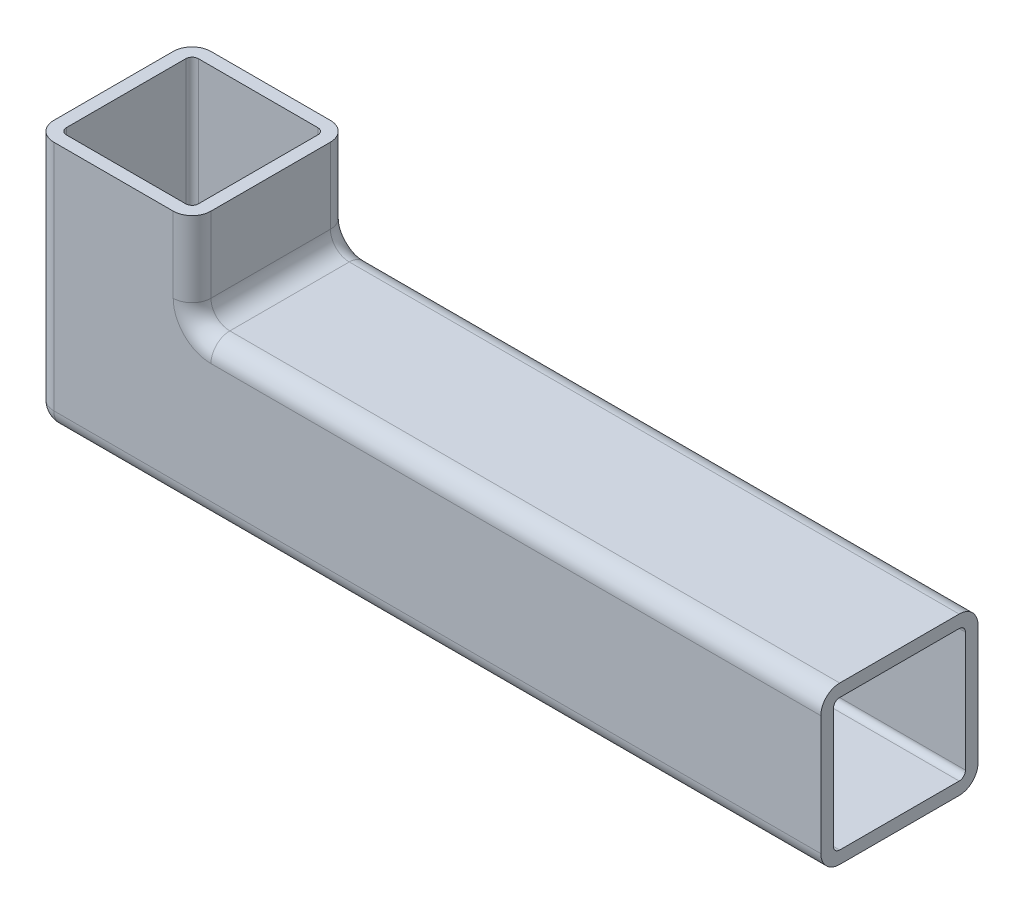
ISO-10303-21;
HEADER;
FILE_DESCRIPTION(('STEP AP214'),'2;1');
FILE_NAME('part.step','',(''),(''),'','','');
FILE_SCHEMA(('AUTOMOTIVE_DESIGN { 1 0 10303 214 1 1 1 1 }'));
ENDSEC;
DATA;
#1=APPLICATION_CONTEXT('core data for automotive mechanical design processes');
#2=APPLICATION_PROTOCOL_DEFINITION('international standard','automotive_design',2000,#1);
#3=PRODUCT_CONTEXT('',#1,'mechanical');
#4=PRODUCT('Part','Part','',(#3));
#5=PRODUCT_RELATED_PRODUCT_CATEGORY('part','',(#4));
#6=PRODUCT_DEFINITION_FORMATION('','',#4);
#7=PRODUCT_DEFINITION_CONTEXT('part definition',#1,'design');
#8=PRODUCT_DEFINITION('design','',#6,#7);
#9=PRODUCT_DEFINITION_SHAPE('','',#8);
#10=(LENGTH_UNIT() NAMED_UNIT(*) SI_UNIT(.MILLI.,.METRE.));
#11=(NAMED_UNIT(*) PLANE_ANGLE_UNIT() SI_UNIT($,.RADIAN.));
#12=(NAMED_UNIT(*) SI_UNIT($,.STERADIAN.) SOLID_ANGLE_UNIT());
#13=UNCERTAINTY_MEASURE_WITH_UNIT(LENGTH_MEASURE(1.E-05),#10,'distance_accuracy_value','');
#14=(GEOMETRIC_REPRESENTATION_CONTEXT(3) GLOBAL_UNCERTAINTY_ASSIGNED_CONTEXT((#13)) GLOBAL_UNIT_ASSIGNED_CONTEXT((#10,
#11,#12)) REPRESENTATION_CONTEXT('',''));
#15=CARTESIAN_POINT('',(0.,0.,0.));
#16=DIRECTION('',(0.,0.,1.));
#17=DIRECTION('',(1.,0.,0.));
#18=AXIS2_PLACEMENT_3D('',#15,#16,#17);
#19=CARTESIAN_POINT('',(0.,0.,25.));
#20=DIRECTION('',(1.,0.,0.));
#21=DIRECTION('',(0.,0.,-1.));
#22=AXIS2_PLACEMENT_3D('',#19,#20,#21);
#23=PLANE('',#22);
#24=DIRECTION('',(0.,-1.,0.));
#25=VECTOR('',#24,1.);
#26=CARTESIAN_POINT('',(0.,0.,3.));
#27=LINE('',#26,#25);
#28=CARTESIAN_POINT('',(0.,40.,3.));
#29=VERTEX_POINT('',#28);
#30=CARTESIAN_POINT('',(0.,3.,3.));
#31=VERTEX_POINT('',#30);
#32=EDGE_CURVE('E355',#29,#31,#27,.T.);
#33=ORIENTED_EDGE('',*,*,#32,.T.);
#34=DIRECTION('',(0.,0.,-1.));
#35=VECTOR('',#34,1.);
#36=CARTESIAN_POINT('',(0.,3.,25.));
#37=LINE('',#36,#35);
#38=CARTESIAN_POINT('',(0.,3.,22.));
#39=VERTEX_POINT('',#38);
#40=EDGE_CURVE('E405',#31,#39,#37,.F.);
#41=ORIENTED_EDGE('',*,*,#40,.T.);
#42=DIRECTION('',(0.,-1.,0.));
#43=VECTOR('',#42,1.);
#44=CARTESIAN_POINT('',(0.,0.,22.));
#45=LINE('',#44,#43);
#46=CARTESIAN_POINT('',(0.,40.,22.));
#47=VERTEX_POINT('',#46);
#48=EDGE_CURVE('E353',#39,#47,#45,.F.);
#49=ORIENTED_EDGE('',*,*,#48,.T.);
#50=DIRECTION('',(0.,0.,-1.));
#51=VECTOR('',#50,1.);
#52=CARTESIAN_POINT('',(0.,40.,25.));
#53=LINE('',#52,#51);
#54=EDGE_CURVE('E258',#47,#29,#53,.T.);
#55=ORIENTED_EDGE('',*,*,#54,.T.);
#56=EDGE_LOOP('',(#33,#41,#49,#55));
#57=FACE_BOUND('',#56,.T.);
#58=ADVANCED_FACE('F42',(#57),#23,.F.);
#59=CARTESIAN_POINT('',(0.,0.,25.));
#60=DIRECTION('',(0.,1.,0.));
#61=DIRECTION('',(0.,0.,1.));
#62=AXIS2_PLACEMENT_3D('',#59,#60,#61);
#63=PLANE('',#62);
#64=DIRECTION('',(1.,0.,0.));
#65=VECTOR('',#64,1.);
#66=CARTESIAN_POINT('',(0.,0.,22.));
#67=LINE('',#66,#65);
#68=CARTESIAN_POINT('',(125.,0.,22.));
#69=VERTEX_POINT('',#68);
#70=CARTESIAN_POINT('',(3.,0.,22.));
#71=VERTEX_POINT('',#70);
#72=EDGE_CURVE('E336',#69,#71,#67,.F.);
#73=ORIENTED_EDGE('',*,*,#72,.T.);
#74=DIRECTION('',(0.,0.,-1.));
#75=VECTOR('',#74,1.);
#76=CARTESIAN_POINT('',(3.,0.,25.));
#77=LINE('',#76,#75);
#78=CARTESIAN_POINT('',(3.,0.,3.));
#79=VERTEX_POINT('',#78);
#80=EDGE_CURVE('E66',#71,#79,#77,.T.);
#81=ORIENTED_EDGE('',*,*,#80,.T.);
#82=DIRECTION('',(1.,0.,0.));
#83=VECTOR('',#82,1.);
#84=CARTESIAN_POINT('',(125.,0.,3.));
#85=LINE('',#84,#83);
#86=CARTESIAN_POINT('',(125.,0.,3.));
#87=VERTEX_POINT('',#86);
#88=EDGE_CURVE('E382',#79,#87,#85,.T.);
#89=ORIENTED_EDGE('',*,*,#88,.T.);
#90=DIRECTION('',(0.,0.,-1.));
#91=VECTOR('',#90,1.);
#92=CARTESIAN_POINT('',(125.,0.,25.));
#93=LINE('',#92,#91);
#94=EDGE_CURVE('E253',#69,#87,#93,.T.);
#95=ORIENTED_EDGE('',*,*,#94,.F.);
#96=EDGE_LOOP('',(#73,#81,#89,#95));
#97=FACE_BOUND('',#96,.T.);
#98=ADVANCED_FACE('F531',(#97),#63,.F.);
#99=CARTESIAN_POINT('',(125.,0.,25.));
#100=DIRECTION('',(-1.,0.,0.));
#101=DIRECTION('',(0.,0.,1.));
#102=AXIS2_PLACEMENT_3D('',#99,#100,#101);
#103=PLANE('',#102);
#104=DIRECTION('',(0.,0.,-1.));
#105=VECTOR('',#104,1.);
#106=CARTESIAN_POINT('',(125.,2.,23.));
#107=LINE('',#106,#105);
#108=CARTESIAN_POINT('',(125.,2.,22.));
#109=VERTEX_POINT('',#108);
#110=CARTESIAN_POINT('',(125.,2.,3.));
#111=VERTEX_POINT('',#110);
#112=EDGE_CURVE('E458',#109,#111,#107,.T.);
#113=ORIENTED_EDGE('',*,*,#112,.F.);
#114=CARTESIAN_POINT('',(125.,3.,22.));
#115=DIRECTION('',(-1.,0.,0.));
#116=DIRECTION('',(0.,0.,1.));
#117=AXIS2_PLACEMENT_3D('',#114,#115,#116);
#118=CIRCLE('',#117,1.);
#119=CARTESIAN_POINT('',(125.,3.,23.));
#120=VERTEX_POINT('',#119);
#121=EDGE_CURVE('E278',#109,#120,#118,.T.);
#122=ORIENTED_EDGE('',*,*,#121,.T.);
#123=DIRECTION('',(0.,-1.,0.));
#124=VECTOR('',#123,1.);
#125=CARTESIAN_POINT('',(125.,23.,23.));
#126=LINE('',#125,#124);
#127=CARTESIAN_POINT('',(125.,22.,23.));
#128=VERTEX_POINT('',#127);
#129=EDGE_CURVE('E460',#128,#120,#126,.T.);
#130=ORIENTED_EDGE('',*,*,#129,.F.);
#131=CARTESIAN_POINT('',(125.,22.,22.));
#132=DIRECTION('',(-1.,0.,0.));
#133=DIRECTION('',(0.,0.,1.));
#134=AXIS2_PLACEMENT_3D('',#131,#132,#133);
#135=CIRCLE('',#134,1.);
#136=CARTESIAN_POINT('',(125.,23.,22.));
#137=VERTEX_POINT('',#136);
#138=EDGE_CURVE('E299',#128,#137,#135,.T.);
#139=ORIENTED_EDGE('',*,*,#138,.T.);
#140=DIRECTION('',(0.,0.,1.));
#141=VECTOR('',#140,1.);
#142=CARTESIAN_POINT('',(125.,23.,23.));
#143=LINE('',#142,#141);
#144=CARTESIAN_POINT('',(125.,23.,3.));
#145=VERTEX_POINT('',#144);
#146=EDGE_CURVE('E452',#145,#137,#143,.T.);
#147=ORIENTED_EDGE('',*,*,#146,.F.);
#148=CARTESIAN_POINT('',(125.,22.,3.));
#149=DIRECTION('',(-1.,0.,0.));
#150=DIRECTION('',(0.,0.,1.));
#151=AXIS2_PLACEMENT_3D('',#148,#149,#150);
#152=CIRCLE('',#151,1.);
#153=CARTESIAN_POINT('',(125.,22.,2.));
#154=VERTEX_POINT('',#153);
#155=EDGE_CURVE('E291',#145,#154,#152,.T.);
#156=ORIENTED_EDGE('',*,*,#155,.T.);
#157=DIRECTION('',(0.,1.,0.));
#158=VECTOR('',#157,1.);
#159=CARTESIAN_POINT('',(125.,23.,2.));
#160=LINE('',#159,#158);
#161=CARTESIAN_POINT('',(125.,3.,2.));
#162=VERTEX_POINT('',#161);
#163=EDGE_CURVE('E455',#162,#154,#160,.T.);
#164=ORIENTED_EDGE('',*,*,#163,.F.);
#165=CARTESIAN_POINT('',(125.,3.,3.));
#166=DIRECTION('',(-1.,0.,0.));
#167=DIRECTION('',(0.,0.,1.));
#168=AXIS2_PLACEMENT_3D('',#165,#166,#167);
#169=CIRCLE('',#168,1.);
#170=EDGE_CURVE('E246',#162,#111,#169,.T.);
#171=ORIENTED_EDGE('',*,*,#170,.T.);
#172=EDGE_LOOP('',(#113,#122,#130,#139,#147,#156,#164,#171));
#173=FACE_BOUND('',#172,.T.);
#174=ORIENTED_EDGE('',*,*,#94,.T.);
#175=CARTESIAN_POINT('',(125.,3.,3.));
#176=DIRECTION('',(-1.,0.,0.));
#177=DIRECTION('',(0.,0.,1.));
#178=AXIS2_PLACEMENT_3D('',#175,#176,#177);
#179=CIRCLE('',#178,3.);
#180=CARTESIAN_POINT('',(125.,3.,0.));
#181=VERTEX_POINT('',#180);
#182=EDGE_CURVE('E386',#87,#181,#179,.F.);
#183=ORIENTED_EDGE('',*,*,#182,.T.);
#184=DIRECTION('',(0.,1.,0.));
#185=VECTOR('',#184,1.);
#186=CARTESIAN_POINT('',(125.,0.,0.));
#187=LINE('',#186,#185);
#188=CARTESIAN_POINT('',(125.,22.,0.));
#189=VERTEX_POINT('',#188);
#190=EDGE_CURVE('E429',#181,#189,#187,.T.);
#191=ORIENTED_EDGE('',*,*,#190,.T.);
#192=CARTESIAN_POINT('',(125.,22.,3.));
#193=DIRECTION('',(-1.,0.,0.));
#194=DIRECTION('',(0.,0.,1.));
#195=AXIS2_PLACEMENT_3D('',#192,#193,#194);
#196=CIRCLE('',#195,3.);
#197=CARTESIAN_POINT('',(125.,25.,3.));
#198=VERTEX_POINT('',#197);
#199=EDGE_CURVE('E384',#189,#198,#196,.F.);
#200=ORIENTED_EDGE('',*,*,#199,.T.);
#201=DIRECTION('',(0.,0.,1.));
#202=VECTOR('',#201,1.);
#203=CARTESIAN_POINT('',(125.,25.,0.));
#204=LINE('',#203,#202);
#205=CARTESIAN_POINT('',(125.,25.,22.));
#206=VERTEX_POINT('',#205);
#207=EDGE_CURVE('E448',#198,#206,#204,.T.);
#208=ORIENTED_EDGE('',*,*,#207,.T.);
#209=CARTESIAN_POINT('',(125.,22.,22.));
#210=DIRECTION('',(-1.,0.,0.));
#211=DIRECTION('',(0.,0.,1.));
#212=AXIS2_PLACEMENT_3D('',#209,#210,#211);
#213=CIRCLE('',#212,3.);
#214=CARTESIAN_POINT('',(125.,22.,25.));
#215=VERTEX_POINT('',#214);
#216=EDGE_CURVE('E332',#206,#215,#213,.F.);
#217=ORIENTED_EDGE('',*,*,#216,.T.);
#218=DIRECTION('',(0.,1.,0.));
#219=VECTOR('',#218,1.);
#220=CARTESIAN_POINT('',(125.,0.,25.));
#221=LINE('',#220,#219);
#222=CARTESIAN_POINT('',(125.,3.,25.));
#223=VERTEX_POINT('',#222);
#224=EDGE_CURVE('E440',#223,#215,#221,.T.);
#225=ORIENTED_EDGE('',*,*,#224,.F.);
#226=CARTESIAN_POINT('',(125.,3.,22.));
#227=DIRECTION('',(-1.,0.,0.));
#228=DIRECTION('',(0.,0.,1.));
#229=AXIS2_PLACEMENT_3D('',#226,#227,#228);
#230=CIRCLE('',#229,3.);
#231=EDGE_CURVE('E334',#223,#69,#230,.F.);
#232=ORIENTED_EDGE('',*,*,#231,.T.);
#233=EDGE_LOOP('',(#174,#183,#191,#200,#208,#217,#225,#232));
#234=FACE_BOUND('',#233,.T.);
#235=ADVANCED_FACE('F490',(#173,#234),#103,.F.);
#236=CARTESIAN_POINT('',(0.,40.,25.));
#237=DIRECTION('',(0.,-1.,0.));
#238=DIRECTION('',(0.,0.,-1.));
#239=AXIS2_PLACEMENT_3D('',#236,#237,#238);
#240=PLANE('',#239);
#241=DIRECTION('',(-1.,0.,0.));
#242=VECTOR('',#241,1.);
#243=CARTESIAN_POINT('',(23.,40.,2.));
#244=LINE('',#243,#242);
#245=CARTESIAN_POINT('',(22.,40.,2.));
#246=VERTEX_POINT('',#245);
#247=CARTESIAN_POINT('',(3.,40.,2.));
#248=VERTEX_POINT('',#247);
#249=EDGE_CURVE('E224',#246,#248,#244,.T.);
#250=ORIENTED_EDGE('',*,*,#249,.F.);
#251=CARTESIAN_POINT('',(22.,40.,3.00000000000001));
#252=DIRECTION('',(0.,-1.,0.));
#253=DIRECTION('',(0.,0.,-1.));
#254=AXIS2_PLACEMENT_3D('',#251,#252,#253);
#255=CIRCLE('',#254,1.);
#256=CARTESIAN_POINT('',(23.,40.,3.00000000000001));
#257=VERTEX_POINT('',#256);
#258=EDGE_CURVE('E314',#246,#257,#255,.T.);
#259=ORIENTED_EDGE('',*,*,#258,.T.);
#260=DIRECTION('',(0.,0.,-1.));
#261=VECTOR('',#260,1.);
#262=CARTESIAN_POINT('',(23.,40.,2.));
#263=LINE('',#262,#261);
#264=CARTESIAN_POINT('',(23.,40.,22.));
#265=VERTEX_POINT('',#264);
#266=EDGE_CURVE('E235',#265,#257,#263,.T.);
#267=ORIENTED_EDGE('',*,*,#266,.F.);
#268=CARTESIAN_POINT('',(22.,40.,22.));
#269=DIRECTION('',(0.,-1.,0.));
#270=DIRECTION('',(0.,0.,-1.));
#271=AXIS2_PLACEMENT_3D('',#268,#269,#270);
#272=CIRCLE('',#271,1.);
#273=CARTESIAN_POINT('',(22.,40.,23.));
#274=VERTEX_POINT('',#273);
#275=EDGE_CURVE('E307',#265,#274,#272,.T.);
#276=ORIENTED_EDGE('',*,*,#275,.T.);
#277=DIRECTION('',(1.,0.,0.));
#278=VECTOR('',#277,1.);
#279=CARTESIAN_POINT('',(23.,40.,23.));
#280=LINE('',#279,#278);
#281=CARTESIAN_POINT('',(3.,40.,23.));
#282=VERTEX_POINT('',#281);
#283=EDGE_CURVE('E466',#282,#274,#280,.T.);
#284=ORIENTED_EDGE('',*,*,#283,.F.);
#285=CARTESIAN_POINT('',(3.,40.,22.));
#286=DIRECTION('',(0.,-1.,0.));
#287=DIRECTION('',(0.,0.,-1.));
#288=AXIS2_PLACEMENT_3D('',#285,#286,#287);
#289=CIRCLE('',#288,1.);
#290=CARTESIAN_POINT('',(2.,40.,22.));
#291=VERTEX_POINT('',#290);
#292=EDGE_CURVE('E281',#282,#291,#289,.T.);
#293=ORIENTED_EDGE('',*,*,#292,.T.);
#294=DIRECTION('',(0.,0.,1.));
#295=VECTOR('',#294,1.);
#296=CARTESIAN_POINT('',(2.,40.,2.));
#297=LINE('',#296,#295);
#298=CARTESIAN_POINT('',(2.,40.,3.00000000000001));
#299=VERTEX_POINT('',#298);
#300=EDGE_CURVE('E234',#299,#291,#297,.T.);
#301=ORIENTED_EDGE('',*,*,#300,.F.);
#302=CARTESIAN_POINT('',(3.,40.,3.00000000000001));
#303=DIRECTION('',(0.,-1.,0.));
#304=DIRECTION('',(0.,0.,-1.));
#305=AXIS2_PLACEMENT_3D('',#302,#303,#304);
#306=CIRCLE('',#305,1.);
#307=EDGE_CURVE('E239',#299,#248,#306,.T.);
#308=ORIENTED_EDGE('',*,*,#307,.T.);
#309=EDGE_LOOP('',(#250,#259,#267,#276,#284,#293,#301,#308));
#310=FACE_BOUND('',#309,.T.);
#311=DIRECTION('',(-1.,0.,0.));
#312=VECTOR('',#311,1.);
#313=CARTESIAN_POINT('',(0.,40.,0.));
#314=LINE('',#313,#312);
#315=CARTESIAN_POINT('',(22.,40.,0.));
#316=VERTEX_POINT('',#315);
#317=CARTESIAN_POINT('',(3.,40.,0.));
#318=VERTEX_POINT('',#317);
#319=EDGE_CURVE('E435',#316,#318,#314,.T.);
#320=ORIENTED_EDGE('',*,*,#319,.T.);
#321=CARTESIAN_POINT('',(3.,40.,3.));
#322=DIRECTION('',(0.,-1.,0.));
#323=DIRECTION('',(0.,0.,-1.));
#324=AXIS2_PLACEMENT_3D('',#321,#322,#323);
#325=CIRCLE('',#324,3.);
#326=EDGE_CURVE('E380',#318,#29,#325,.F.);
#327=ORIENTED_EDGE('',*,*,#326,.T.);
#328=ORIENTED_EDGE('',*,*,#54,.F.);
#329=CARTESIAN_POINT('',(3.,40.,22.));
#330=DIRECTION('',(0.,-1.,0.));
#331=DIRECTION('',(0.,0.,-1.));
#332=AXIS2_PLACEMENT_3D('',#329,#330,#331);
#333=CIRCLE('',#332,3.);
#334=CARTESIAN_POINT('',(3.,40.,25.));
#335=VERTEX_POINT('',#334);
#336=EDGE_CURVE('E348',#47,#335,#333,.F.);
#337=ORIENTED_EDGE('',*,*,#336,.T.);
#338=DIRECTION('',(-1.,0.,0.));
#339=VECTOR('',#338,1.);
#340=CARTESIAN_POINT('',(0.,40.,25.));
#341=LINE('',#340,#339);
#342=CARTESIAN_POINT('',(22.,40.,25.));
#343=VERTEX_POINT('',#342);
#344=EDGE_CURVE('E438',#343,#335,#341,.T.);
#345=ORIENTED_EDGE('',*,*,#344,.F.);
#346=CARTESIAN_POINT('',(22.,40.,22.));
#347=DIRECTION('',(0.,-1.,0.));
#348=DIRECTION('',(0.,0.,-1.));
#349=AXIS2_PLACEMENT_3D('',#346,#347,#348);
#350=CIRCLE('',#349,3.);
#351=CARTESIAN_POINT('',(25.,40.,22.));
#352=VERTEX_POINT('',#351);
#353=EDGE_CURVE('E350',#343,#352,#350,.F.);
#354=ORIENTED_EDGE('',*,*,#353,.T.);
#355=DIRECTION('',(0.,0.,1.));
#356=VECTOR('',#355,1.);
#357=CARTESIAN_POINT('',(25.,40.,0.));
#358=LINE('',#357,#356);
#359=CARTESIAN_POINT('',(25.,40.,3.));
#360=VERTEX_POINT('',#359);
#361=EDGE_CURVE('E444',#360,#352,#358,.T.);
#362=ORIENTED_EDGE('',*,*,#361,.F.);
#363=CARTESIAN_POINT('',(22.,40.,3.));
#364=DIRECTION('',(0.,-1.,0.));
#365=DIRECTION('',(0.,0.,-1.));
#366=AXIS2_PLACEMENT_3D('',#363,#364,#365);
#367=CIRCLE('',#366,3.);
#368=EDGE_CURVE('E378',#360,#316,#367,.F.);
#369=ORIENTED_EDGE('',*,*,#368,.T.);
#370=EDGE_LOOP('',(#320,#327,#328,#337,#345,#354,#362,#369));
#371=FACE_BOUND('',#370,.T.);
#372=ADVANCED_FACE('F240',(#310,#371),#240,.F.);
#373=CARTESIAN_POINT('',(0.,0.,25.));
#374=DIRECTION('',(0.,0.,-1.));
#375=DIRECTION('',(-1.,0.,0.));
#376=AXIS2_PLACEMENT_3D('',#373,#374,#375);
#377=PLANE('',#376);
#378=ORIENTED_EDGE('',*,*,#224,.T.);
#379=DIRECTION('',(1.,0.,0.));
#380=VECTOR('',#379,1.);
#381=CARTESIAN_POINT('',(0.,22.,25.));
#382=LINE('',#381,#380);
#383=CARTESIAN_POINT('',(28.,22.,25.));
#384=VERTEX_POINT('',#383);
#385=EDGE_CURVE('E330',#215,#384,#382,.F.);
#386=ORIENTED_EDGE('',*,*,#385,.T.);
#387=CARTESIAN_POINT('',(28.,28.,25.));
#388=DIRECTION('',(0.,0.,-1.));
#389=DIRECTION('',(-1.,0.,0.));
#390=AXIS2_PLACEMENT_3D('',#387,#388,#389);
#391=CIRCLE('',#390,6.);
#392=CARTESIAN_POINT('',(22.,28.,25.));
#393=VERTEX_POINT('',#392);
#394=EDGE_CURVE('E327',#393,#384,#391,.F.);
#395=ORIENTED_EDGE('',*,*,#394,.F.);
#396=DIRECTION('',(0.,-1.,0.));
#397=VECTOR('',#396,1.);
#398=CARTESIAN_POINT('',(22.,0.,25.));
#399=LINE('',#398,#397);
#400=EDGE_CURVE('E325',#393,#343,#399,.F.);
#401=ORIENTED_EDGE('',*,*,#400,.T.);
#402=ORIENTED_EDGE('',*,*,#344,.T.);
#403=DIRECTION('',(0.,-1.,0.));
#404=VECTOR('',#403,1.);
#405=CARTESIAN_POINT('',(3.,0.,25.));
#406=LINE('',#405,#404);
#407=CARTESIAN_POINT('',(3.,3.,25.));
#408=VERTEX_POINT('',#407);
#409=EDGE_CURVE('E319',#335,#408,#406,.T.);
#410=ORIENTED_EDGE('',*,*,#409,.T.);
#411=DIRECTION('',(1.,0.,0.));
#412=VECTOR('',#411,1.);
#413=CARTESIAN_POINT('',(0.,3.,25.));
#414=LINE('',#413,#412);
#415=EDGE_CURVE('E322',#408,#223,#414,.T.);
#416=ORIENTED_EDGE('',*,*,#415,.T.);
#417=EDGE_LOOP('',(#378,#386,#395,#401,#402,#410,#416));
#418=FACE_BOUND('',#417,.T.);
#419=ADVANCED_FACE('F566',(#418),#377,.F.);
#420=CARTESIAN_POINT('',(0.,0.,0.));
#421=DIRECTION('',(0.,0.,-1.));
#422=DIRECTION('',(-1.,0.,0.));
#423=AXIS2_PLACEMENT_3D('',#420,#421,#422);
#424=PLANE('',#423);
#425=DIRECTION('',(1.,0.,0.));
#426=VECTOR('',#425,1.);
#427=CARTESIAN_POINT('',(0.,3.,0.));
#428=LINE('',#427,#426);
#429=CARTESIAN_POINT('',(3.,3.,0.));
#430=VERTEX_POINT('',#429);
#431=EDGE_CURVE('E373',#181,#430,#428,.F.);
#432=ORIENTED_EDGE('',*,*,#431,.T.);
#433=DIRECTION('',(0.,-1.,0.));
#434=VECTOR('',#433,1.);
#435=CARTESIAN_POINT('',(3.,40.,0.));
#436=LINE('',#435,#434);
#437=EDGE_CURVE('E376',#430,#318,#436,.F.);
#438=ORIENTED_EDGE('',*,*,#437,.T.);
#439=ORIENTED_EDGE('',*,*,#319,.F.);
#440=DIRECTION('',(0.,-1.,0.));
#441=VECTOR('',#440,1.);
#442=CARTESIAN_POINT('',(22.,28.,0.));
#443=LINE('',#442,#441);
#444=CARTESIAN_POINT('',(22.,28.,0.));
#445=VERTEX_POINT('',#444);
#446=EDGE_CURVE('E366',#316,#445,#443,.T.);
#447=ORIENTED_EDGE('',*,*,#446,.T.);
#448=CARTESIAN_POINT('',(28.,28.,0.));
#449=DIRECTION('',(0.,0.,-1.));
#450=DIRECTION('',(-1.,0.,0.));
#451=AXIS2_PLACEMENT_3D('',#448,#449,#450);
#452=CIRCLE('',#451,6.);
#453=CARTESIAN_POINT('',(28.,22.,0.));
#454=VERTEX_POINT('',#453);
#455=EDGE_CURVE('E368',#445,#454,#452,.F.);
#456=ORIENTED_EDGE('',*,*,#455,.T.);
#457=DIRECTION('',(1.,0.,0.));
#458=VECTOR('',#457,1.);
#459=CARTESIAN_POINT('',(125.,22.,0.));
#460=LINE('',#459,#458);
#461=EDGE_CURVE('E370',#454,#189,#460,.T.);
#462=ORIENTED_EDGE('',*,*,#461,.T.);
#463=ORIENTED_EDGE('',*,*,#190,.F.);
#464=EDGE_LOOP('',(#432,#438,#439,#447,#456,#462,#463));
#465=FACE_BOUND('',#464,.T.);
#466=ADVANCED_FACE('F425',(#465),#424,.T.);
#467=CARTESIAN_POINT('',(25.,40.,0.));
#468=DIRECTION('',(-1.,0.,0.));
#469=DIRECTION('',(0.,-1.,0.));
#470=AXIS2_PLACEMENT_3D('',#467,#468,#469);
#471=PLANE('',#470);
#472=DIRECTION('',(0.,0.,1.));
#473=VECTOR('',#472,1.);
#474=CARTESIAN_POINT('',(25.,28.,0.));
#475=LINE('',#474,#473);
#476=CARTESIAN_POINT('',(25.,28.,22.));
#477=VERTEX_POINT('',#476);
#478=CARTESIAN_POINT('',(25.,28.,3.));
#479=VERTEX_POINT('',#478);
#480=EDGE_CURVE('E345',#477,#479,#475,.F.);
#481=ORIENTED_EDGE('',*,*,#480,.T.);
#482=DIRECTION('',(0.,-1.,0.));
#483=VECTOR('',#482,1.);
#484=CARTESIAN_POINT('',(25.,40.,3.));
#485=LINE('',#484,#483);
#486=EDGE_CURVE('E392',#479,#360,#485,.F.);
#487=ORIENTED_EDGE('',*,*,#486,.T.);
#488=ORIENTED_EDGE('',*,*,#361,.T.);
#489=DIRECTION('',(0.,-1.,0.));
#490=VECTOR('',#489,1.);
#491=CARTESIAN_POINT('',(25.,40.,22.));
#492=LINE('',#491,#490);
#493=EDGE_CURVE('E343',#352,#477,#492,.T.);
#494=ORIENTED_EDGE('',*,*,#493,.T.);
#495=EDGE_LOOP('',(#481,#487,#488,#494));
#496=FACE_BOUND('',#495,.T.);
#497=ADVANCED_FACE('F561',(#496),#471,.F.);
#498=CARTESIAN_POINT('',(25.,25.,0.));
#499=DIRECTION('',(0.,-1.,0.));
#500=DIRECTION('',(0.,0.,-1.));
#501=AXIS2_PLACEMENT_3D('',#498,#499,#500);
#502=PLANE('',#501);
#503=ORIENTED_EDGE('',*,*,#207,.F.);
#504=DIRECTION('',(1.,0.,0.));
#505=VECTOR('',#504,1.);
#506=CARTESIAN_POINT('',(28.,25.,3.));
#507=LINE('',#506,#505);
#508=CARTESIAN_POINT('',(28.,25.,3.));
#509=VERTEX_POINT('',#508);
#510=EDGE_CURVE('E388',#198,#509,#507,.F.);
#511=ORIENTED_EDGE('',*,*,#510,.T.);
#512=DIRECTION('',(0.,0.,1.));
#513=VECTOR('',#512,1.);
#514=CARTESIAN_POINT('',(28.,25.,25.));
#515=LINE('',#514,#513);
#516=CARTESIAN_POINT('',(28.,25.,22.));
#517=VERTEX_POINT('',#516);
#518=EDGE_CURVE('E338',#509,#517,#515,.T.);
#519=ORIENTED_EDGE('',*,*,#518,.T.);
#520=DIRECTION('',(1.,0.,0.));
#521=VECTOR('',#520,1.);
#522=CARTESIAN_POINT('',(25.,25.,22.));
#523=LINE('',#522,#521);
#524=EDGE_CURVE('E340',#517,#206,#523,.T.);
#525=ORIENTED_EDGE('',*,*,#524,.T.);
#526=EDGE_LOOP('',(#503,#511,#519,#525));
#527=FACE_BOUND('',#526,.T.);
#528=ADVANCED_FACE('F558',(#527),#502,.F.);
#529=CARTESIAN_POINT('',(2.,23.,23.));
#530=DIRECTION('',(0.,0.,1.));
#531=DIRECTION('',(0.,-1.,0.));
#532=AXIS2_PLACEMENT_3D('',#529,#530,#531);
#533=PLANE('',#532);
#534=ORIENTED_EDGE('',*,*,#283,.T.);
#535=DIRECTION('',(0.,1.,0.));
#536=VECTOR('',#535,1.);
#537=CARTESIAN_POINT('',(22.,22.,23.));
#538=LINE('',#537,#536);
#539=CARTESIAN_POINT('',(22.,22.,23.));
#540=VERTEX_POINT('',#539);
#541=EDGE_CURVE('E304',#274,#540,#538,.F.);
#542=ORIENTED_EDGE('',*,*,#541,.T.);
#543=DIRECTION('',(1.,0.,0.));
#544=VECTOR('',#543,1.);
#545=CARTESIAN_POINT('',(125.,22.,23.));
#546=LINE('',#545,#544);
#547=EDGE_CURVE('E293',#540,#128,#546,.T.);
#548=ORIENTED_EDGE('',*,*,#547,.T.);
#549=ORIENTED_EDGE('',*,*,#129,.T.);
#550=DIRECTION('',(1.,0.,0.));
#551=VECTOR('',#550,1.);
#552=CARTESIAN_POINT('',(2.,3.,23.));
#553=LINE('',#552,#551);
#554=CARTESIAN_POINT('',(3.,3.,23.));
#555=VERTEX_POINT('',#554);
#556=EDGE_CURVE('E274',#120,#555,#553,.F.);
#557=ORIENTED_EDGE('',*,*,#556,.T.);
#558=DIRECTION('',(0.,-1.,0.));
#559=VECTOR('',#558,1.);
#560=CARTESIAN_POINT('',(3.,23.,23.));
#561=LINE('',#560,#559);
#562=EDGE_CURVE('E272',#555,#282,#561,.F.);
#563=ORIENTED_EDGE('',*,*,#562,.T.);
#564=EDGE_LOOP('',(#534,#542,#548,#549,#557,#563));
#565=FACE_BOUND('',#564,.T.);
#566=ADVANCED_FACE('F497',(#565),#533,.F.);
#567=CARTESIAN_POINT('',(2.,23.,23.));
#568=DIRECTION('',(0.,1.,0.));
#569=DIRECTION('',(0.,0.,1.));
#570=AXIS2_PLACEMENT_3D('',#567,#568,#569);
#571=PLANE('',#570);
#572=ORIENTED_EDGE('',*,*,#146,.T.);
#573=DIRECTION('',(1.,0.,0.));
#574=VECTOR('',#573,1.);
#575=CARTESIAN_POINT('',(23.,23.,22.));
#576=LINE('',#575,#574);
#577=CARTESIAN_POINT('',(23.,23.,22.));
#578=VERTEX_POINT('',#577);
#579=EDGE_CURVE('E296',#137,#578,#576,.F.);
#580=ORIENTED_EDGE('',*,*,#579,.T.);
#581=DIRECTION('',(0.,0.,-1.));
#582=VECTOR('',#581,1.);
#583=CARTESIAN_POINT('',(23.,23.,23.));
#584=LINE('',#583,#582);
#585=CARTESIAN_POINT('',(23.,23.,3.));
#586=VERTEX_POINT('',#585);
#587=EDGE_CURVE('E462',#578,#586,#584,.T.);
#588=ORIENTED_EDGE('',*,*,#587,.T.);
#589=DIRECTION('',(1.,0.,0.));
#590=VECTOR('',#589,1.);
#591=CARTESIAN_POINT('',(125.,23.,3.));
#592=LINE('',#591,#590);
#593=EDGE_CURVE('E283',#586,#145,#592,.T.);
#594=ORIENTED_EDGE('',*,*,#593,.T.);
#595=EDGE_LOOP('',(#572,#580,#588,#594));
#596=FACE_BOUND('',#595,.T.);
#597=ADVANCED_FACE('F486',(#596),#571,.F.);
#598=CARTESIAN_POINT('',(2.,23.,2.));
#599=DIRECTION('',(0.,0.,-1.));
#600=DIRECTION('',(0.,1.,0.));
#601=AXIS2_PLACEMENT_3D('',#598,#599,#600);
#602=PLANE('',#601);
#603=DIRECTION('',(1.,0.,0.));
#604=VECTOR('',#603,1.);
#605=CARTESIAN_POINT('',(23.,22.,2.));
#606=LINE('',#605,#604);
#607=CARTESIAN_POINT('',(22.,22.,2.));
#608=VERTEX_POINT('',#607);
#609=EDGE_CURVE('E289',#154,#608,#606,.F.);
#610=ORIENTED_EDGE('',*,*,#609,.T.);
#611=DIRECTION('',(0.,1.,0.));
#612=VECTOR('',#611,1.);
#613=CARTESIAN_POINT('',(22.,40.,2.00000000000001));
#614=LINE('',#613,#612);
#615=EDGE_CURVE('E232',#608,#246,#614,.T.);
#616=ORIENTED_EDGE('',*,*,#615,.T.);
#617=ORIENTED_EDGE('',*,*,#249,.T.);
#618=DIRECTION('',(0.,1.,0.));
#619=VECTOR('',#618,1.);
#620=CARTESIAN_POINT('',(3.,23.,2.));
#621=LINE('',#620,#619);
#622=CARTESIAN_POINT('',(3.,3.,2.));
#623=VERTEX_POINT('',#622);
#624=EDGE_CURVE('E229',#248,#623,#621,.F.);
#625=ORIENTED_EDGE('',*,*,#624,.T.);
#626=DIRECTION('',(1.,0.,0.));
#627=VECTOR('',#626,1.);
#628=CARTESIAN_POINT('',(125.,3.,2.));
#629=LINE('',#628,#627);
#630=EDGE_CURVE('E252',#623,#162,#629,.T.);
#631=ORIENTED_EDGE('',*,*,#630,.T.);
#632=ORIENTED_EDGE('',*,*,#163,.T.);
#633=EDGE_LOOP('',(#610,#616,#617,#625,#631,#632));
#634=FACE_BOUND('',#633,.T.);
#635=ADVANCED_FACE('F226',(#634),#602,.F.);
#636=CARTESIAN_POINT('',(2.,2.,23.));
#637=DIRECTION('',(0.,-1.,0.));
#638=DIRECTION('',(0.,0.,-1.));
#639=AXIS2_PLACEMENT_3D('',#636,#637,#638);
#640=PLANE('',#639);
#641=DIRECTION('',(0.,0.,-1.));
#642=VECTOR('',#641,1.);
#643=CARTESIAN_POINT('',(2.,2.,23.));
#644=LINE('',#643,#642);
#645=CARTESIAN_POINT('',(2.,2.,22.));
#646=VERTEX_POINT('',#645);
#647=CARTESIAN_POINT('',(2.,2.,3.));
#648=VERTEX_POINT('',#647);
#649=EDGE_CURVE('E450',#646,#648,#644,.T.);
#650=ORIENTED_EDGE('',*,*,#649,.F.);
#651=DIRECTION('',(1.,0.,0.));
#652=VECTOR('',#651,1.);
#653=CARTESIAN_POINT('',(125.,2.,22.));
#654=LINE('',#653,#652);
#655=EDGE_CURVE('E245',#646,#109,#654,.T.);
#656=ORIENTED_EDGE('',*,*,#655,.T.);
#657=ORIENTED_EDGE('',*,*,#112,.T.);
#658=DIRECTION('',(1.,0.,0.));
#659=VECTOR('',#658,1.);
#660=CARTESIAN_POINT('',(2.,2.,3.));
#661=LINE('',#660,#659);
#662=EDGE_CURVE('E255',#111,#648,#661,.F.);
#663=ORIENTED_EDGE('',*,*,#662,.T.);
#664=EDGE_LOOP('',(#650,#656,#657,#663));
#665=FACE_BOUND('',#664,.T.);
#666=ADVANCED_FACE('F514',(#665),#640,.F.);
#667=CARTESIAN_POINT('',(2.,0.,0.));
#668=DIRECTION('',(1.,0.,0.));
#669=DIRECTION('',(0.,0.,-1.));
#670=AXIS2_PLACEMENT_3D('',#667,#668,#669);
#671=PLANE('',#670);
#672=ORIENTED_EDGE('',*,*,#300,.T.);
#673=DIRECTION('',(0.,-1.,0.));
#674=VECTOR('',#673,1.);
#675=CARTESIAN_POINT('',(2.,0.,22.));
#676=LINE('',#675,#674);
#677=EDGE_CURVE('E276',#291,#646,#676,.T.);
#678=ORIENTED_EDGE('',*,*,#677,.T.);
#679=ORIENTED_EDGE('',*,*,#649,.T.);
#680=DIRECTION('',(0.,1.,0.));
#681=VECTOR('',#680,1.);
#682=CARTESIAN_POINT('',(2.,0.,2.99999999999999));
#683=LINE('',#682,#681);
#684=EDGE_CURVE('E264',#648,#299,#683,.T.);
#685=ORIENTED_EDGE('',*,*,#684,.T.);
#686=EDGE_LOOP('',(#672,#678,#679,#685));
#687=FACE_BOUND('',#686,.T.);
#688=ADVANCED_FACE('F512',(#687),#671,.T.);
#689=CARTESIAN_POINT('',(23.,2.,2.));
#690=DIRECTION('',(1.,0.,0.));
#691=DIRECTION('',(0.,0.,-1.));
#692=AXIS2_PLACEMENT_3D('',#689,#690,#691);
#693=PLANE('',#692);
#694=ORIENTED_EDGE('',*,*,#266,.T.);
#695=DIRECTION('',(0.,1.,0.));
#696=VECTOR('',#695,1.);
#697=CARTESIAN_POINT('',(23.,22.,3.));
#698=LINE('',#697,#696);
#699=EDGE_CURVE('E312',#257,#586,#698,.F.);
#700=ORIENTED_EDGE('',*,*,#699,.T.);
#701=ORIENTED_EDGE('',*,*,#587,.F.);
#702=DIRECTION('',(0.,1.,0.));
#703=VECTOR('',#702,1.);
#704=CARTESIAN_POINT('',(23.,40.,22.));
#705=LINE('',#704,#703);
#706=EDGE_CURVE('E301',#578,#265,#705,.T.);
#707=ORIENTED_EDGE('',*,*,#706,.T.);
#708=EDGE_LOOP('',(#694,#700,#701,#707));
#709=FACE_BOUND('',#708,.T.);
#710=ADVANCED_FACE('F474',(#709),#693,.F.);
#711=CARTESIAN_POINT('',(3.,0.,2.99999999999999));
#712=DIRECTION('',(0.,1.,0.));
#713=DIRECTION('',(0.,0.,1.));
#714=AXIS2_PLACEMENT_3D('',#711,#712,#713);
#715=CYLINDRICAL_SURFACE('',#714,1.);
#716=ORIENTED_EDGE('',*,*,#307,.F.);
#717=ORIENTED_EDGE('',*,*,#684,.F.);
#718=CARTESIAN_POINT('',(3.,3.,2.99999999999999));
#719=DIRECTION('',(-0.707106781186547,0.707106781186547,0.));
#720=DIRECTION('',(-0.707106781186547,-0.707106781186547,0.));
#721=AXIS2_PLACEMENT_3D('',#718,#719,#720);
#722=ELLIPSE('',#721,1.41421356237309,1.);
#723=EDGE_CURVE('E250',#623,#648,#722,.T.);
#724=ORIENTED_EDGE('',*,*,#723,.F.);
#725=ORIENTED_EDGE('',*,*,#624,.F.);
#726=EDGE_LOOP('',(#716,#717,#724,#725));
#727=FACE_BOUND('',#726,.T.);
#728=ADVANCED_FACE('F248',(#727),#715,.F.);
#729=CARTESIAN_POINT('',(2.,3.,3.));
#730=DIRECTION('',(-1.,0.,0.));
#731=DIRECTION('',(0.,0.,1.));
#732=AXIS2_PLACEMENT_3D('',#729,#730,#731);
#733=CYLINDRICAL_SURFACE('',#732,1.);
#734=ORIENTED_EDGE('',*,*,#723,.T.);
#735=ORIENTED_EDGE('',*,*,#662,.F.);
#736=ORIENTED_EDGE('',*,*,#170,.F.);
#737=ORIENTED_EDGE('',*,*,#630,.F.);
#738=EDGE_LOOP('',(#734,#735,#736,#737));
#739=FACE_BOUND('',#738,.T.);
#740=ADVANCED_FACE('F517',(#739),#733,.F.);
#741=CARTESIAN_POINT('',(3.,0.,22.));
#742=DIRECTION('',(0.,-1.,0.));
#743=DIRECTION('',(0.,0.,-1.));
#744=AXIS2_PLACEMENT_3D('',#741,#742,#743);
#745=CYLINDRICAL_SURFACE('',#744,1.);
#746=ORIENTED_EDGE('',*,*,#292,.F.);
#747=ORIENTED_EDGE('',*,*,#562,.F.);
#748=CARTESIAN_POINT('',(3.,3.,22.));
#749=DIRECTION('',(-0.707106781186547,0.707106781186547,0.));
#750=DIRECTION('',(-0.707106781186547,-0.707106781186547,0.));
#751=AXIS2_PLACEMENT_3D('',#748,#749,#750);
#752=ELLIPSE('',#751,1.41421356237309,1.);
#753=EDGE_CURVE('E269',#646,#555,#752,.T.);
#754=ORIENTED_EDGE('',*,*,#753,.F.);
#755=ORIENTED_EDGE('',*,*,#677,.F.);
#756=EDGE_LOOP('',(#746,#747,#754,#755));
#757=FACE_BOUND('',#756,.T.);
#758=ADVANCED_FACE('F507',(#757),#745,.F.);
#759=CARTESIAN_POINT('',(2.,3.,22.));
#760=DIRECTION('',(-1.,0.,0.));
#761=DIRECTION('',(0.,0.,1.));
#762=AXIS2_PLACEMENT_3D('',#759,#760,#761);
#763=CYLINDRICAL_SURFACE('',#762,1.);
#764=ORIENTED_EDGE('',*,*,#753,.T.);
#765=ORIENTED_EDGE('',*,*,#556,.F.);
#766=ORIENTED_EDGE('',*,*,#121,.F.);
#767=ORIENTED_EDGE('',*,*,#655,.F.);
#768=EDGE_LOOP('',(#764,#765,#766,#767));
#769=FACE_BOUND('',#768,.T.);
#770=ADVANCED_FACE('F520',(#769),#763,.F.);
#771=CARTESIAN_POINT('',(2.,22.,3.));
#772=DIRECTION('',(-1.,0.,0.));
#773=DIRECTION('',(0.,0.,1.));
#774=AXIS2_PLACEMENT_3D('',#771,#772,#773);
#775=CYLINDRICAL_SURFACE('',#774,1.);
#776=ORIENTED_EDGE('',*,*,#593,.F.);
#777=CARTESIAN_POINT('',(22.,22.,3.));
#778=DIRECTION('',(-0.707106781186547,0.707106781186547,0.));
#779=DIRECTION('',(-0.707106781186547,-0.707106781186547,0.));
#780=AXIS2_PLACEMENT_3D('',#777,#778,#779);
#781=ELLIPSE('',#780,1.41421356237309,1.);
#782=EDGE_CURVE('E316',#586,#608,#781,.T.);
#783=ORIENTED_EDGE('',*,*,#782,.T.);
#784=ORIENTED_EDGE('',*,*,#609,.F.);
#785=ORIENTED_EDGE('',*,*,#155,.F.);
#786=EDGE_LOOP('',(#776,#783,#784,#785));
#787=FACE_BOUND('',#786,.T.);
#788=ADVANCED_FACE('F483',(#787),#775,.F.);
#789=CARTESIAN_POINT('',(2.,22.,22.));
#790=DIRECTION('',(-1.,0.,0.));
#791=DIRECTION('',(0.,0.,1.));
#792=AXIS2_PLACEMENT_3D('',#789,#790,#791);
#793=CYLINDRICAL_SURFACE('',#792,1.);
#794=ORIENTED_EDGE('',*,*,#547,.F.);
#795=CARTESIAN_POINT('',(22.,22.,22.));
#796=DIRECTION('',(-0.707106781186547,0.707106781186547,0.));
#797=DIRECTION('',(-0.707106781186547,-0.707106781186547,0.));
#798=AXIS2_PLACEMENT_3D('',#795,#796,#797);
#799=ELLIPSE('',#798,1.41421356237309,1.);
#800=EDGE_CURVE('E309',#540,#578,#799,.T.);
#801=ORIENTED_EDGE('',*,*,#800,.T.);
#802=ORIENTED_EDGE('',*,*,#579,.F.);
#803=ORIENTED_EDGE('',*,*,#138,.F.);
#804=EDGE_LOOP('',(#794,#801,#802,#803));
#805=FACE_BOUND('',#804,.T.);
#806=ADVANCED_FACE('F495',(#805),#793,.F.);
#807=CARTESIAN_POINT('',(22.,2.,22.));
#808=DIRECTION('',(0.,-1.,0.));
#809=DIRECTION('',(0.,0.,-1.));
#810=AXIS2_PLACEMENT_3D('',#807,#808,#809);
#811=CYLINDRICAL_SURFACE('',#810,1.);
#812=ORIENTED_EDGE('',*,*,#800,.F.);
#813=ORIENTED_EDGE('',*,*,#541,.F.);
#814=ORIENTED_EDGE('',*,*,#275,.F.);
#815=ORIENTED_EDGE('',*,*,#706,.F.);
#816=EDGE_LOOP('',(#812,#813,#814,#815));
#817=FACE_BOUND('',#816,.T.);
#818=ADVANCED_FACE('F502',(#817),#811,.F.);
#819=CARTESIAN_POINT('',(22.,23.,3.));
#820=DIRECTION('',(0.,-1.,0.));
#821=DIRECTION('',(0.,0.,-1.));
#822=AXIS2_PLACEMENT_3D('',#819,#820,#821);
#823=CYLINDRICAL_SURFACE('',#822,1.);
#824=ORIENTED_EDGE('',*,*,#782,.F.);
#825=ORIENTED_EDGE('',*,*,#699,.F.);
#826=ORIENTED_EDGE('',*,*,#258,.F.);
#827=ORIENTED_EDGE('',*,*,#615,.F.);
#828=EDGE_LOOP('',(#824,#825,#826,#827));
#829=FACE_BOUND('',#828,.T.);
#830=ADVANCED_FACE('F479',(#829),#823,.F.);
#831=CARTESIAN_POINT('',(3.,0.,22.));
#832=DIRECTION('',(0.,-1.,0.));
#833=DIRECTION('',(0.,0.,-1.));
#834=AXIS2_PLACEMENT_3D('',#831,#832,#833);
#835=CYLINDRICAL_SURFACE('',#834,3.);
#836=ORIENTED_EDGE('',*,*,#48,.F.);
#837=CARTESIAN_POINT('',(3.,3.,22.));
#838=DIRECTION('',(0.,-1.,0.));
#839=DIRECTION('',(0.,0.,-1.));
#840=AXIS2_PLACEMENT_3D('',#837,#838,#839);
#841=CIRCLE('',#840,3.);
#842=EDGE_CURVE('E402',#39,#408,#841,.F.);
#843=ORIENTED_EDGE('',*,*,#842,.T.);
#844=ORIENTED_EDGE('',*,*,#409,.F.);
#845=ORIENTED_EDGE('',*,*,#336,.F.);
#846=EDGE_LOOP('',(#836,#843,#844,#845));
#847=FACE_BOUND('',#846,.T.);
#848=ADVANCED_FACE('F653',(#847),#835,.T.);
#849=CARTESIAN_POINT('',(0.,3.,22.));
#850=DIRECTION('',(1.,0.,0.));
#851=DIRECTION('',(0.,0.,-1.));
#852=AXIS2_PLACEMENT_3D('',#849,#850,#851);
#853=CYLINDRICAL_SURFACE('',#852,3.);
#854=ORIENTED_EDGE('',*,*,#415,.F.);
#855=CARTESIAN_POINT('',(3.,3.,22.));
#856=DIRECTION('',(1.,0.,0.));
#857=DIRECTION('',(0.,0.,-1.));
#858=AXIS2_PLACEMENT_3D('',#855,#856,#857);
#859=CIRCLE('',#858,3.);
#860=EDGE_CURVE('E394',#408,#71,#859,.T.);
#861=ORIENTED_EDGE('',*,*,#860,.T.);
#862=ORIENTED_EDGE('',*,*,#72,.F.);
#863=ORIENTED_EDGE('',*,*,#231,.F.);
#864=EDGE_LOOP('',(#854,#861,#862,#863));
#865=FACE_BOUND('',#864,.T.);
#866=ADVANCED_FACE('F661',(#865),#853,.T.);
#867=CARTESIAN_POINT('',(22.,40.,22.));
#868=DIRECTION('',(0.,-1.,0.));
#869=DIRECTION('',(1.,0.,0.));
#870=AXIS2_PLACEMENT_3D('',#867,#868,#869);
#871=CYLINDRICAL_SURFACE('',#870,3.);
#872=ORIENTED_EDGE('',*,*,#353,.F.);
#873=ORIENTED_EDGE('',*,*,#400,.F.);
#874=CARTESIAN_POINT('',(22.,28.,22.));
#875=DIRECTION('',(0.,-1.,0.));
#876=DIRECTION('',(1.,0.,0.));
#877=AXIS2_PLACEMENT_3D('',#874,#875,#876);
#878=CIRCLE('',#877,3.);
#879=EDGE_CURVE('E286',#477,#393,#878,.T.);
#880=ORIENTED_EDGE('',*,*,#879,.F.);
#881=ORIENTED_EDGE('',*,*,#493,.F.);
#882=EDGE_LOOP('',(#872,#873,#880,#881));
#883=FACE_BOUND('',#882,.T.);
#884=ADVANCED_FACE('F670',(#883),#871,.T.);
#885=CARTESIAN_POINT('',(28.,28.,0.));
#886=DIRECTION('',(0.,0.,-1.));
#887=DIRECTION('',(-1.,0.,0.));
#888=AXIS2_PLACEMENT_3D('',#885,#886,#887);
#889=CYLINDRICAL_SURFACE('',#888,3.);
#890=ORIENTED_EDGE('',*,*,#518,.F.);
#891=CARTESIAN_POINT('',(28.,28.,3.));
#892=DIRECTION('',(0.,0.,-1.));
#893=DIRECTION('',(-1.,0.,0.));
#894=AXIS2_PLACEMENT_3D('',#891,#892,#893);
#895=CIRCLE('',#894,3.);
#896=EDGE_CURVE('E390',#509,#479,#895,.T.);
#897=ORIENTED_EDGE('',*,*,#896,.T.);
#898=ORIENTED_EDGE('',*,*,#480,.F.);
#899=CARTESIAN_POINT('',(28.,28.,22.));
#900=DIRECTION('',(0.,0.,-1.));
#901=DIRECTION('',(-1.,0.,0.));
#902=AXIS2_PLACEMENT_3D('',#899,#900,#901);
#903=CIRCLE('',#902,3.);
#904=EDGE_CURVE('E359',#517,#477,#903,.T.);
#905=ORIENTED_EDGE('',*,*,#904,.F.);
#906=EDGE_LOOP('',(#890,#897,#898,#905));
#907=FACE_BOUND('',#906,.T.);
#908=ADVANCED_FACE('F679',(#907),#889,.F.);
#909=CARTESIAN_POINT('',(28.,28.,22.));
#910=DIRECTION('',(0.,0.,-1.));
#911=DIRECTION('',(-1.,0.,0.));
#912=AXIS2_PLACEMENT_3D('',#909,#910,#911);
#913=TOROIDAL_SURFACE('',#912,6.,3.);
#914=ORIENTED_EDGE('',*,*,#879,.T.);
#915=ORIENTED_EDGE('',*,*,#394,.T.);
#916=CARTESIAN_POINT('',(28.,22.,22.));
#917=DIRECTION('',(-1.,0.,0.));
#918=DIRECTION('',(0.,0.,1.));
#919=AXIS2_PLACEMENT_3D('',#916,#917,#918);
#920=CIRCLE('',#919,3.);
#921=EDGE_CURVE('E356',#517,#384,#920,.F.);
#922=ORIENTED_EDGE('',*,*,#921,.F.);
#923=ORIENTED_EDGE('',*,*,#904,.T.);
#924=EDGE_LOOP('',(#914,#915,#922,#923));
#925=FACE_BOUND('',#924,.T.);
#926=ADVANCED_FACE('F688',(#925),#913,.T.);
#927=CARTESIAN_POINT('',(25.,22.,22.));
#928=DIRECTION('',(1.,0.,0.));
#929=DIRECTION('',(0.,0.,-1.));
#930=AXIS2_PLACEMENT_3D('',#927,#928,#929);
#931=CYLINDRICAL_SURFACE('',#930,3.);
#932=ORIENTED_EDGE('',*,*,#921,.T.);
#933=ORIENTED_EDGE('',*,*,#385,.F.);
#934=ORIENTED_EDGE('',*,*,#216,.F.);
#935=ORIENTED_EDGE('',*,*,#524,.F.);
#936=EDGE_LOOP('',(#932,#933,#934,#935));
#937=FACE_BOUND('',#936,.T.);
#938=ADVANCED_FACE('F697',(#937),#931,.T.);
#939=CARTESIAN_POINT('',(0.,3.,3.));
#940=DIRECTION('',(-1.,0.,0.));
#941=DIRECTION('',(0.,0.,1.));
#942=AXIS2_PLACEMENT_3D('',#939,#940,#941);
#943=CYLINDRICAL_SURFACE('',#942,3.);
#944=ORIENTED_EDGE('',*,*,#88,.F.);
#945=CARTESIAN_POINT('',(3.,3.,3.));
#946=DIRECTION('',(-1.,0.,0.));
#947=DIRECTION('',(0.,0.,1.));
#948=AXIS2_PLACEMENT_3D('',#945,#946,#947);
#949=CIRCLE('',#948,3.);
#950=EDGE_CURVE('E11',#79,#430,#949,.F.);
#951=ORIENTED_EDGE('',*,*,#950,.T.);
#952=ORIENTED_EDGE('',*,*,#431,.F.);
#953=ORIENTED_EDGE('',*,*,#182,.F.);
#954=EDGE_LOOP('',(#944,#951,#952,#953));
#955=FACE_BOUND('',#954,.T.);
#956=ADVANCED_FACE('F421',(#955),#943,.T.);
#957=CARTESIAN_POINT('',(3.,0.,3.));
#958=DIRECTION('',(0.,1.,0.));
#959=DIRECTION('',(0.,0.,1.));
#960=AXIS2_PLACEMENT_3D('',#957,#958,#959);
#961=CYLINDRICAL_SURFACE('',#960,3.);
#962=ORIENTED_EDGE('',*,*,#437,.F.);
#963=CARTESIAN_POINT('',(3.,3.,3.));
#964=DIRECTION('',(0.,1.,0.));
#965=DIRECTION('',(0.,0.,1.));
#966=AXIS2_PLACEMENT_3D('',#963,#964,#965);
#967=CIRCLE('',#966,3.);
#968=EDGE_CURVE('E51',#430,#31,#967,.T.);
#969=ORIENTED_EDGE('',*,*,#968,.T.);
#970=ORIENTED_EDGE('',*,*,#32,.F.);
#971=ORIENTED_EDGE('',*,*,#326,.F.);
#972=EDGE_LOOP('',(#962,#969,#970,#971));
#973=FACE_BOUND('',#972,.T.);
#974=ADVANCED_FACE('F431',(#973),#961,.T.);
#975=CARTESIAN_POINT('',(22.,0.,3.));
#976=DIRECTION('',(0.,1.,0.));
#977=DIRECTION('',(-1.,0.,0.));
#978=AXIS2_PLACEMENT_3D('',#975,#976,#977);
#979=CYLINDRICAL_SURFACE('',#978,3.);
#980=ORIENTED_EDGE('',*,*,#368,.F.);
#981=ORIENTED_EDGE('',*,*,#486,.F.);
#982=CARTESIAN_POINT('',(22.,28.,3.));
#983=DIRECTION('',(0.,-1.,0.));
#984=DIRECTION('',(1.,0.,0.));
#985=AXIS2_PLACEMENT_3D('',#982,#983,#984);
#986=CIRCLE('',#985,3.);
#987=EDGE_CURVE('E360',#445,#479,#986,.T.);
#988=ORIENTED_EDGE('',*,*,#987,.F.);
#989=ORIENTED_EDGE('',*,*,#446,.F.);
#990=EDGE_LOOP('',(#980,#981,#988,#989));
#991=FACE_BOUND('',#990,.T.);
#992=ADVANCED_FACE('F721',(#991),#979,.T.);
#993=CARTESIAN_POINT('',(28.,28.,3.));
#994=DIRECTION('',(0.,0.,-1.));
#995=DIRECTION('',(-1.,0.,0.));
#996=AXIS2_PLACEMENT_3D('',#993,#994,#995);
#997=TOROIDAL_SURFACE('',#996,6.,3.);
#998=ORIENTED_EDGE('',*,*,#987,.T.);
#999=ORIENTED_EDGE('',*,*,#896,.F.);
#1000=CARTESIAN_POINT('',(28.,22.,3.));
#1001=DIRECTION('',(1.,0.,0.));
#1002=DIRECTION('',(0.,0.,-1.));
#1003=AXIS2_PLACEMENT_3D('',#1000,#1001,#1002);
#1004=CIRCLE('',#1003,3.);
#1005=EDGE_CURVE('E395',#454,#509,#1004,.T.);
#1006=ORIENTED_EDGE('',*,*,#1005,.F.);
#1007=ORIENTED_EDGE('',*,*,#455,.F.);
#1008=EDGE_LOOP('',(#998,#999,#1006,#1007));
#1009=FACE_BOUND('',#1008,.T.);
#1010=ADVANCED_FACE('F729',(#1009),#997,.T.);
#1011=CARTESIAN_POINT('',(0.,22.,3.));
#1012=DIRECTION('',(-1.,0.,0.));
#1013=DIRECTION('',(0.,0.,1.));
#1014=AXIS2_PLACEMENT_3D('',#1011,#1012,#1013);
#1015=CYLINDRICAL_SURFACE('',#1014,3.);
#1016=ORIENTED_EDGE('',*,*,#1005,.T.);
#1017=ORIENTED_EDGE('',*,*,#510,.F.);
#1018=ORIENTED_EDGE('',*,*,#199,.F.);
#1019=ORIENTED_EDGE('',*,*,#461,.F.);
#1020=EDGE_LOOP('',(#1016,#1017,#1018,#1019));
#1021=FACE_BOUND('',#1020,.T.);
#1022=ADVANCED_FACE('F738',(#1021),#1015,.T.);
#1023=CARTESIAN_POINT('',(3.,3.,3.));
#1024=DIRECTION('',(0.,0.,1.));
#1025=DIRECTION('',(1.,0.,0.));
#1026=AXIS2_PLACEMENT_3D('',#1023,#1024,#1025);
#1027=SPHERICAL_SURFACE('',#1026,3.);
#1028=ORIENTED_EDGE('',*,*,#968,.F.);
#1029=ORIENTED_EDGE('',*,*,#950,.F.);
#1030=CARTESIAN_POINT('',(3.,3.,3.));
#1031=DIRECTION('',(0.,0.,1.));
#1032=DIRECTION('',(1.,0.,0.));
#1033=AXIS2_PLACEMENT_3D('',#1030,#1031,#1032);
#1034=CIRCLE('',#1033,3.);
#1035=EDGE_CURVE('E46',#31,#79,#1034,.T.);
#1036=ORIENTED_EDGE('',*,*,#1035,.F.);
#1037=EDGE_LOOP('',(#1028,#1029,#1036));
#1038=FACE_BOUND('',#1037,.T.);
#1039=ADVANCED_FACE('F44',(#1038),#1027,.T.);
#1040=CARTESIAN_POINT('',(3.,3.,25.));
#1041=DIRECTION('',(0.,0.,-1.));
#1042=DIRECTION('',(-1.,0.,0.));
#1043=AXIS2_PLACEMENT_3D('',#1040,#1041,#1042);
#1044=CYLINDRICAL_SURFACE('',#1043,3.);
#1045=ORIENTED_EDGE('',*,*,#1035,.T.);
#1046=ORIENTED_EDGE('',*,*,#80,.F.);
#1047=CARTESIAN_POINT('',(3.,3.,22.));
#1048=DIRECTION('',(0.,0.,1.));
#1049=DIRECTION('',(1.,0.,0.));
#1050=AXIS2_PLACEMENT_3D('',#1047,#1048,#1049);
#1051=CIRCLE('',#1050,3.);
#1052=EDGE_CURVE('E407',#39,#71,#1051,.T.);
#1053=ORIENTED_EDGE('',*,*,#1052,.F.);
#1054=ORIENTED_EDGE('',*,*,#40,.F.);
#1055=EDGE_LOOP('',(#1045,#1046,#1053,#1054));
#1056=FACE_BOUND('',#1055,.T.);
#1057=ADVANCED_FACE('F416',(#1056),#1044,.T.);
#1058=CARTESIAN_POINT('',(3.,3.,22.));
#1059=DIRECTION('',(0.,0.,1.));
#1060=DIRECTION('',(1.,0.,0.));
#1061=AXIS2_PLACEMENT_3D('',#1058,#1059,#1060);
#1062=SPHERICAL_SURFACE('',#1061,3.);
#1063=ORIENTED_EDGE('',*,*,#860,.F.);
#1064=ORIENTED_EDGE('',*,*,#842,.F.);
#1065=ORIENTED_EDGE('',*,*,#1052,.T.);
#1066=EDGE_LOOP('',(#1063,#1064,#1065));
#1067=FACE_BOUND('',#1066,.T.);
#1068=ADVANCED_FACE('F761',(#1067),#1062,.T.);
#1069=CLOSED_SHELL('',(#58,#98,#235,#372,#419,#466,#497,#528,#566,#597,#635,#666,#688,#710,#728,
#740,#758,#770,#788,#806,#818,#830,#848,#866,#884,#908,#926,#938,#956,#974,#992,#1010,#1022,
#1039,#1057,#1068));
#1070=MANIFOLD_SOLID_BREP('B2',#1069);
#1071=ADVANCED_BREP_SHAPE_REPRESENTATION('',(#18,#1070),#14);
#1072=SHAPE_DEFINITION_REPRESENTATION(#9,#1071);
ENDSEC;
END-ISO-10303-21;
